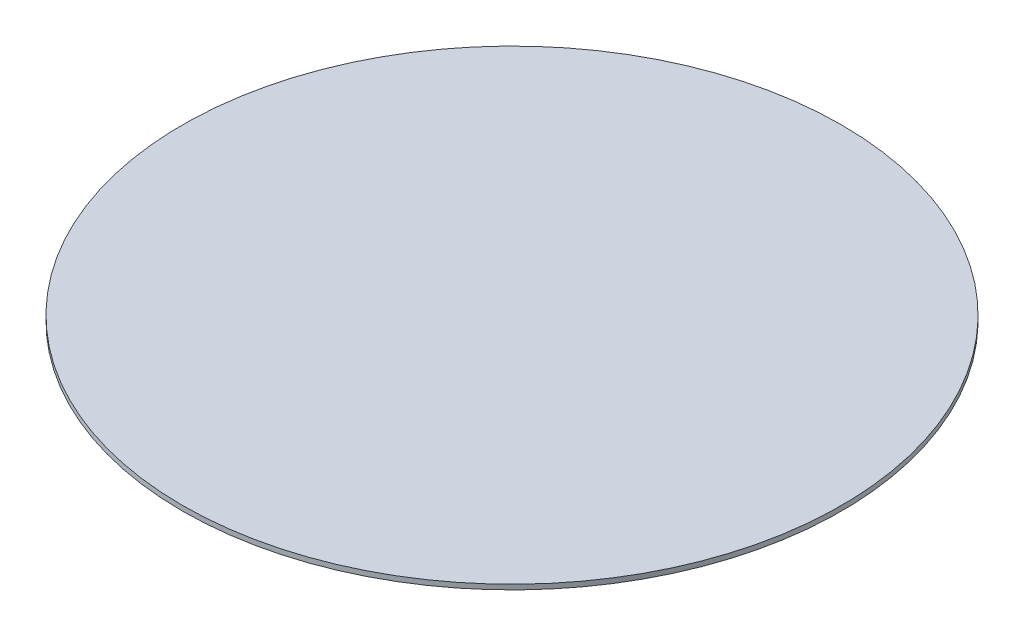
ISO-10303-21;
HEADER;
FILE_DESCRIPTION(('STEP AP214'),'2;1');
FILE_NAME('part.step','',(''),(''),'','','');
FILE_SCHEMA(('AUTOMOTIVE_DESIGN { 1 0 10303 214 1 1 1 1 }'));
ENDSEC;
DATA;
#1=APPLICATION_CONTEXT('core data for automotive mechanical design processes');
#2=APPLICATION_PROTOCOL_DEFINITION('international standard','automotive_design',2000,#1);
#3=PRODUCT_CONTEXT('',#1,'mechanical');
#4=PRODUCT('Part','Part','',(#3));
#5=PRODUCT_RELATED_PRODUCT_CATEGORY('part','',(#4));
#6=PRODUCT_DEFINITION_FORMATION('','',#4);
#7=PRODUCT_DEFINITION_CONTEXT('part definition',#1,'design');
#8=PRODUCT_DEFINITION('design','',#6,#7);
#9=PRODUCT_DEFINITION_SHAPE('','',#8);
#10=(LENGTH_UNIT() NAMED_UNIT(*) SI_UNIT(.MILLI.,.METRE.));
#11=(NAMED_UNIT(*) PLANE_ANGLE_UNIT() SI_UNIT($,.RADIAN.));
#12=(NAMED_UNIT(*) SI_UNIT($,.STERADIAN.) SOLID_ANGLE_UNIT());
#13=UNCERTAINTY_MEASURE_WITH_UNIT(LENGTH_MEASURE(1.E-05),#10,'distance_accuracy_value','');
#14=(GEOMETRIC_REPRESENTATION_CONTEXT(3) GLOBAL_UNCERTAINTY_ASSIGNED_CONTEXT((#13)) GLOBAL_UNIT_ASSIGNED_CONTEXT((#10,
#11,#12)) REPRESENTATION_CONTEXT('',''));
#15=CARTESIAN_POINT('',(0.,0.,0.));
#16=DIRECTION('',(0.,0.,1.));
#17=DIRECTION('',(1.,0.,0.));
#18=AXIS2_PLACEMENT_3D('',#15,#16,#17);
#19=CARTESIAN_POINT('',(0.,3.,0.));
#20=DIRECTION('',(0.,-1.,0.));
#21=DIRECTION('',(0.,0.,-1.));
#22=AXIS2_PLACEMENT_3D('',#19,#20,#21);
#23=CYLINDRICAL_SURFACE('',#22,200.);
#24=CARTESIAN_POINT('',(0.,3.,0.));
#25=DIRECTION('',(0.,1.,0.));
#26=DIRECTION('',(0.,0.,1.));
#27=AXIS2_PLACEMENT_3D('',#24,#25,#26);
#28=CIRCLE('',#27,200.);
#29=CARTESIAN_POINT('',(0.,3.,200.));
#30=VERTEX_POINT('',#29);
#31=EDGE_CURVE('E10',#30,#30,#28,.T.);
#32=ORIENTED_EDGE('',*,*,#31,.F.);
#33=EDGE_LOOP('',(#32));
#34=FACE_BOUND('',#33,.T.);
#35=CARTESIAN_POINT('',(0.,0.,0.));
#36=DIRECTION('',(0.,1.,0.));
#37=DIRECTION('',(0.,0.,1.));
#38=AXIS2_PLACEMENT_3D('',#35,#36,#37);
#39=CIRCLE('',#38,200.);
#40=CARTESIAN_POINT('',(0.,0.,200.));
#41=VERTEX_POINT('',#40);
#42=EDGE_CURVE('E42',#41,#41,#39,.T.);
#43=ORIENTED_EDGE('',*,*,#42,.T.);
#44=EDGE_LOOP('',(#43));
#45=FACE_BOUND('',#44,.T.);
#46=ADVANCED_FACE('F39',(#34,#45),#23,.T.);
#47=CARTESIAN_POINT('',(0.,3.,0.));
#48=DIRECTION('',(0.,1.,0.));
#49=DIRECTION('',(0.,0.,1.));
#50=AXIS2_PLACEMENT_3D('',#47,#48,#49);
#51=PLANE('',#50);
#52=ORIENTED_EDGE('',*,*,#31,.T.);
#53=EDGE_LOOP('',(#52));
#54=FACE_BOUND('',#53,.T.);
#55=ADVANCED_FACE('F56',(#54),#51,.T.);
#56=CARTESIAN_POINT('',(0.,0.,0.));
#57=DIRECTION('',(0.,1.,0.));
#58=DIRECTION('',(0.,0.,1.));
#59=AXIS2_PLACEMENT_3D('',#56,#57,#58);
#60=PLANE('',#59);
#61=ORIENTED_EDGE('',*,*,#42,.F.);
#62=EDGE_LOOP('',(#61));
#63=FACE_BOUND('',#62,.T.);
#64=ADVANCED_FACE('F54',(#63),#60,.F.);
#65=CLOSED_SHELL('',(#46,#55,#64));
#66=MANIFOLD_SOLID_BREP('B2',#65);
#67=ADVANCED_BREP_SHAPE_REPRESENTATION('',(#18,#66),#14);
#68=SHAPE_DEFINITION_REPRESENTATION(#9,#67);
ENDSEC;
END-ISO-10303-21;
